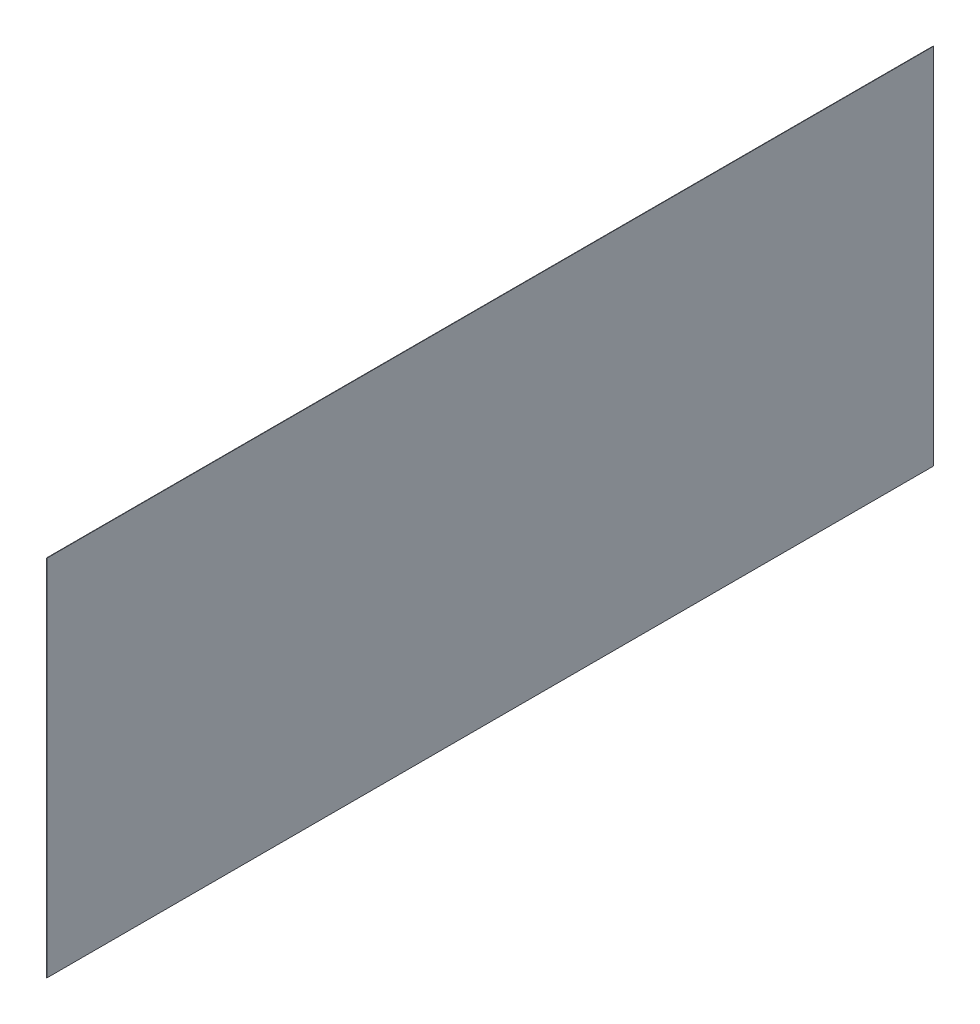
ISO-10303-21;
HEADER;
FILE_DESCRIPTION(('STEP AP214'),'2;1');
FILE_NAME('part.step','',(''),(''),'','','');
FILE_SCHEMA(('AUTOMOTIVE_DESIGN { 1 0 10303 214 1 1 1 1 }'));
ENDSEC;
DATA;
#1=APPLICATION_CONTEXT('core data for automotive mechanical design processes');
#2=APPLICATION_PROTOCOL_DEFINITION('international standard','automotive_design',2000,#1);
#3=PRODUCT_CONTEXT('',#1,'mechanical');
#4=PRODUCT('Part','Part','',(#3));
#5=PRODUCT_RELATED_PRODUCT_CATEGORY('part','',(#4));
#6=PRODUCT_DEFINITION_FORMATION('','',#4);
#7=PRODUCT_DEFINITION_CONTEXT('part definition',#1,'design');
#8=PRODUCT_DEFINITION('design','',#6,#7);
#9=PRODUCT_DEFINITION_SHAPE('','',#8);
#10=(LENGTH_UNIT() NAMED_UNIT(*) SI_UNIT(.MILLI.,.METRE.));
#11=(NAMED_UNIT(*) PLANE_ANGLE_UNIT() SI_UNIT($,.RADIAN.));
#12=(NAMED_UNIT(*) SI_UNIT($,.STERADIAN.) SOLID_ANGLE_UNIT());
#13=UNCERTAINTY_MEASURE_WITH_UNIT(LENGTH_MEASURE(1.E-05),#10,'distance_accuracy_value','');
#14=(GEOMETRIC_REPRESENTATION_CONTEXT(3) GLOBAL_UNCERTAINTY_ASSIGNED_CONTEXT((#13)) GLOBAL_UNIT_ASSIGNED_CONTEXT((#10,
#11,#12)) REPRESENTATION_CONTEXT('',''));
#15=CARTESIAN_POINT('',(0.,0.,0.));
#16=DIRECTION('',(0.,0.,1.));
#17=DIRECTION('',(1.,0.,0.));
#18=AXIS2_PLACEMENT_3D('',#15,#16,#17);
#19=CARTESIAN_POINT('',(-126.327,-60.,150.));
#20=DIRECTION('',(0.,0.,1.));
#21=DIRECTION('',(1.,0.,0.));
#22=AXIS2_PLACEMENT_3D('',#19,#20,#21);
#23=PLANE('',#22);
#24=DIRECTION('',(0.,-1.,0.));
#25=VECTOR('',#24,1.);
#26=CARTESIAN_POINT('',(-126.2,-60.,150.));
#27=LINE('',#26,#25);
#28=CARTESIAN_POINT('',(-126.2,63.,150.));
#29=VERTEX_POINT('',#28);
#30=CARTESIAN_POINT('',(-126.2,-60.,150.));
#31=VERTEX_POINT('',#30);
#32=EDGE_CURVE('E105',#29,#31,#27,.T.);
#33=ORIENTED_EDGE('',*,*,#32,.F.);
#34=DIRECTION('',(1.,0.,0.));
#35=VECTOR('',#34,1.);
#36=CARTESIAN_POINT('',(-126.327,63.,150.));
#37=LINE('',#36,#35);
#38=CARTESIAN_POINT('',(-126.327,63.,150.));
#39=VERTEX_POINT('',#38);
#40=EDGE_CURVE('E11',#39,#29,#37,.T.);
#41=ORIENTED_EDGE('',*,*,#40,.F.);
#42=DIRECTION('',(0.,-1.,0.));
#43=VECTOR('',#42,1.);
#44=CARTESIAN_POINT('',(-126.327,-60.,150.));
#45=LINE('',#44,#43);
#46=CARTESIAN_POINT('',(-126.327,-60.,150.));
#47=VERTEX_POINT('',#46);
#48=EDGE_CURVE('E99',#39,#47,#45,.T.);
#49=ORIENTED_EDGE('',*,*,#48,.T.);
#50=DIRECTION('',(1.,0.,0.));
#51=VECTOR('',#50,1.);
#52=CARTESIAN_POINT('',(-126.327,-60.,150.));
#53=LINE('',#52,#51);
#54=EDGE_CURVE('E44',#47,#31,#53,.T.);
#55=ORIENTED_EDGE('',*,*,#54,.T.);
#56=EDGE_LOOP('',(#33,#41,#49,#55));
#57=FACE_BOUND('',#56,.T.);
#58=ADVANCED_FACE('F41',(#57),#23,.T.);
#59=CARTESIAN_POINT('',(-126.327,63.,150.));
#60=DIRECTION('',(0.,1.,0.));
#61=DIRECTION('',(0.,0.,1.));
#62=AXIS2_PLACEMENT_3D('',#59,#60,#61);
#63=PLANE('',#62);
#64=DIRECTION('',(0.,0.,1.));
#65=VECTOR('',#64,1.);
#66=CARTESIAN_POINT('',(-126.2,63.,150.));
#67=LINE('',#66,#65);
#68=CARTESIAN_POINT('',(-126.2,63.,-150.));
#69=VERTEX_POINT('',#68);
#70=EDGE_CURVE('E101',#69,#29,#67,.T.);
#71=ORIENTED_EDGE('',*,*,#70,.F.);
#72=DIRECTION('',(1.,0.,0.));
#73=VECTOR('',#72,1.);
#74=CARTESIAN_POINT('',(-126.327,63.,-150.));
#75=LINE('',#74,#73);
#76=CARTESIAN_POINT('',(-126.327,63.,-150.));
#77=VERTEX_POINT('',#76);
#78=EDGE_CURVE('E50',#77,#69,#75,.T.);
#79=ORIENTED_EDGE('',*,*,#78,.F.);
#80=DIRECTION('',(0.,0.,1.));
#81=VECTOR('',#80,1.);
#82=CARTESIAN_POINT('',(-126.327,63.,150.));
#83=LINE('',#82,#81);
#84=EDGE_CURVE('E96',#77,#39,#83,.T.);
#85=ORIENTED_EDGE('',*,*,#84,.T.);
#86=ORIENTED_EDGE('',*,*,#40,.T.);
#87=EDGE_LOOP('',(#71,#79,#85,#86));
#88=FACE_BOUND('',#87,.T.);
#89=ADVANCED_FACE('F115',(#88),#63,.T.);
#90=CARTESIAN_POINT('',(-126.327,-60.,-150.));
#91=DIRECTION('',(0.,0.,-1.));
#92=DIRECTION('',(-1.,0.,0.));
#93=AXIS2_PLACEMENT_3D('',#90,#91,#92);
#94=PLANE('',#93);
#95=DIRECTION('',(0.,1.,0.));
#96=VECTOR('',#95,1.);
#97=CARTESIAN_POINT('',(-126.2,-60.,-150.));
#98=LINE('',#97,#96);
#99=CARTESIAN_POINT('',(-126.2,-60.,-150.));
#100=VERTEX_POINT('',#99);
#101=EDGE_CURVE('E91',#100,#69,#98,.T.);
#102=ORIENTED_EDGE('',*,*,#101,.F.);
#103=DIRECTION('',(1.,0.,0.));
#104=VECTOR('',#103,1.);
#105=CARTESIAN_POINT('',(-126.327,-60.,-150.));
#106=LINE('',#105,#104);
#107=CARTESIAN_POINT('',(-126.327,-60.,-150.));
#108=VERTEX_POINT('',#107);
#109=EDGE_CURVE('E86',#108,#100,#106,.T.);
#110=ORIENTED_EDGE('',*,*,#109,.F.);
#111=DIRECTION('',(0.,1.,0.));
#112=VECTOR('',#111,1.);
#113=CARTESIAN_POINT('',(-126.327,-60.,-150.));
#114=LINE('',#113,#112);
#115=EDGE_CURVE('E89',#108,#77,#114,.T.);
#116=ORIENTED_EDGE('',*,*,#115,.T.);
#117=ORIENTED_EDGE('',*,*,#78,.T.);
#118=EDGE_LOOP('',(#102,#110,#116,#117));
#119=FACE_BOUND('',#118,.T.);
#120=ADVANCED_FACE('F88',(#119),#94,.T.);
#121=CARTESIAN_POINT('',(-126.327,-60.,150.));
#122=DIRECTION('',(0.,-1.,0.));
#123=DIRECTION('',(0.,0.,-1.));
#124=AXIS2_PLACEMENT_3D('',#121,#122,#123);
#125=PLANE('',#124);
#126=DIRECTION('',(0.,0.,-1.));
#127=VECTOR('',#126,1.);
#128=CARTESIAN_POINT('',(-126.2,-60.,150.));
#129=LINE('',#128,#127);
#130=EDGE_CURVE('E108',#31,#100,#129,.T.);
#131=ORIENTED_EDGE('',*,*,#130,.F.);
#132=ORIENTED_EDGE('',*,*,#54,.F.);
#133=DIRECTION('',(0.,0.,-1.));
#134=VECTOR('',#133,1.);
#135=CARTESIAN_POINT('',(-126.327,-60.,150.));
#136=LINE('',#135,#134);
#137=EDGE_CURVE('E95',#47,#108,#136,.T.);
#138=ORIENTED_EDGE('',*,*,#137,.T.);
#139=ORIENTED_EDGE('',*,*,#109,.T.);
#140=EDGE_LOOP('',(#131,#132,#138,#139));
#141=FACE_BOUND('',#140,.T.);
#142=ADVANCED_FACE('F98',(#141),#125,.T.);
#143=CARTESIAN_POINT('',(-126.327,0.,0.));
#144=DIRECTION('',(-1.,0.,0.));
#145=DIRECTION('',(0.,0.,1.));
#146=AXIS2_PLACEMENT_3D('',#143,#144,#145);
#147=PLANE('',#146);
#148=ORIENTED_EDGE('',*,*,#48,.F.);
#149=ORIENTED_EDGE('',*,*,#84,.F.);
#150=ORIENTED_EDGE('',*,*,#115,.F.);
#151=ORIENTED_EDGE('',*,*,#137,.F.);
#152=EDGE_LOOP('',(#148,#149,#150,#151));
#153=FACE_BOUND('',#152,.T.);
#154=ADVANCED_FACE('F94',(#153),#147,.T.);
#155=CARTESIAN_POINT('',(-126.2,0.,0.));
#156=DIRECTION('',(-1.,0.,0.));
#157=DIRECTION('',(0.,0.,1.));
#158=AXIS2_PLACEMENT_3D('',#155,#156,#157);
#159=PLANE('',#158);
#160=ORIENTED_EDGE('',*,*,#32,.T.);
#161=ORIENTED_EDGE('',*,*,#130,.T.);
#162=ORIENTED_EDGE('',*,*,#101,.T.);
#163=ORIENTED_EDGE('',*,*,#70,.T.);
#164=EDGE_LOOP('',(#160,#161,#162,#163));
#165=FACE_BOUND('',#164,.T.);
#166=ADVANCED_FACE('F114',(#165),#159,.F.);
#167=CLOSED_SHELL('',(#58,#89,#120,#142,#154,#166));
#168=MANIFOLD_SOLID_BREP('B2',#167);
#169=ADVANCED_BREP_SHAPE_REPRESENTATION('',(#18,#168),#14);
#170=SHAPE_DEFINITION_REPRESENTATION(#9,#169);
ENDSEC;
END-ISO-10303-21;
